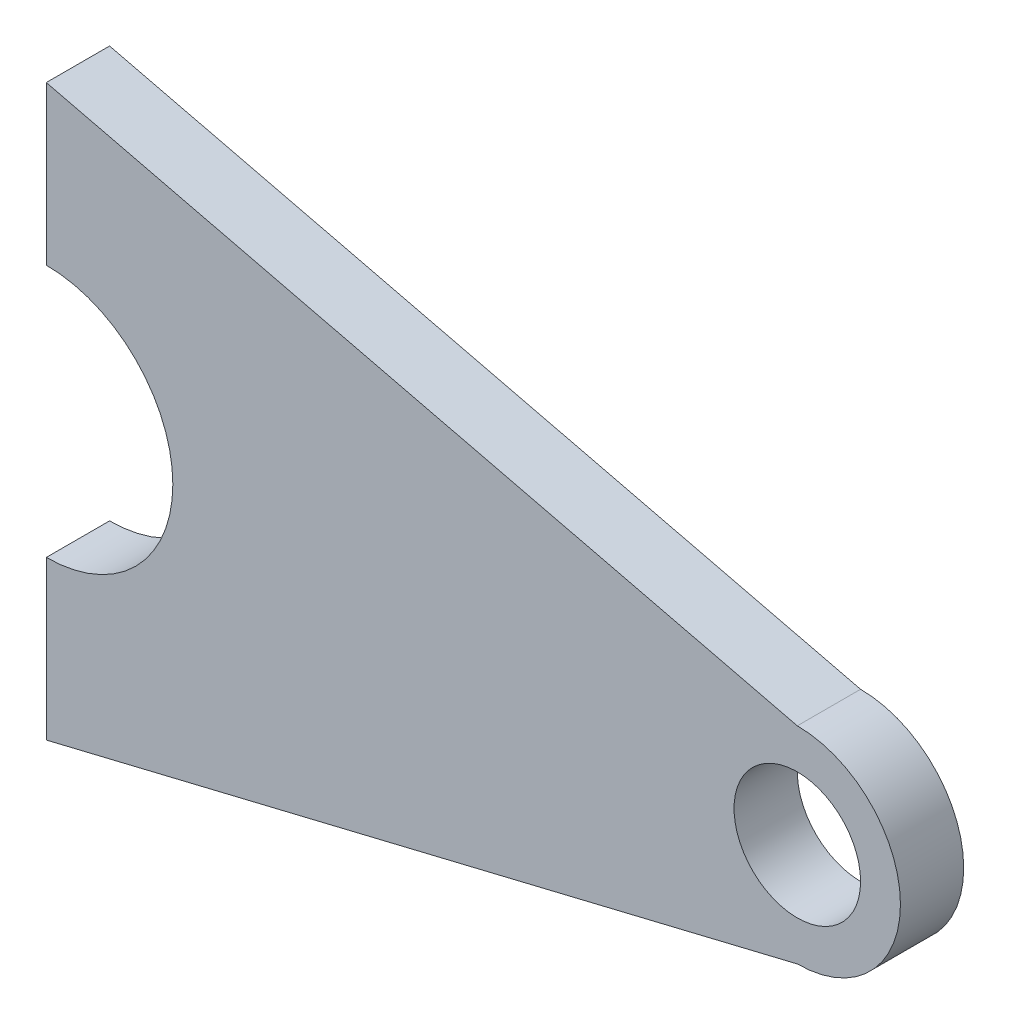
ISO-10303-21;
HEADER;
FILE_DESCRIPTION(('STEP AP214'),'2;1');
FILE_NAME('part.step','',(''),(''),'','','');
FILE_SCHEMA(('AUTOMOTIVE_DESIGN { 1 0 10303 214 1 1 1 1 }'));
ENDSEC;
DATA;
#1=APPLICATION_CONTEXT('core data for automotive mechanical design processes');
#2=APPLICATION_PROTOCOL_DEFINITION('international standard','automotive_design',2000,#1);
#3=PRODUCT_CONTEXT('',#1,'mechanical');
#4=PRODUCT('Part','Part','',(#3));
#5=PRODUCT_RELATED_PRODUCT_CATEGORY('part','',(#4));
#6=PRODUCT_DEFINITION_FORMATION('','',#4);
#7=PRODUCT_DEFINITION_CONTEXT('part definition',#1,'design');
#8=PRODUCT_DEFINITION('design','',#6,#7);
#9=PRODUCT_DEFINITION_SHAPE('','',#8);
#10=(LENGTH_UNIT() NAMED_UNIT(*) SI_UNIT(.MILLI.,.METRE.));
#11=(NAMED_UNIT(*) PLANE_ANGLE_UNIT() SI_UNIT($,.RADIAN.));
#12=(NAMED_UNIT(*) SI_UNIT($,.STERADIAN.) SOLID_ANGLE_UNIT());
#13=UNCERTAINTY_MEASURE_WITH_UNIT(LENGTH_MEASURE(1.E-05),#10,'distance_accuracy_value','');
#14=(GEOMETRIC_REPRESENTATION_CONTEXT(3) GLOBAL_UNCERTAINTY_ASSIGNED_CONTEXT((#13)) GLOBAL_UNIT_ASSIGNED_CONTEXT((#10,
#11,#12)) REPRESENTATION_CONTEXT('',''));
#15=CARTESIAN_POINT('',(0.,0.,0.));
#16=DIRECTION('',(0.,0.,1.));
#17=DIRECTION('',(1.,0.,0.));
#18=AXIS2_PLACEMENT_3D('',#15,#16,#17);
#19=CARTESIAN_POINT('',(-75.375,0.,6.35));
#20=DIRECTION('',(0.,0.,1.));
#21=DIRECTION('',(1.,0.,0.));
#22=AXIS2_PLACEMENT_3D('',#19,#20,#21);
#23=PLANE('',#22);
#24=DIRECTION('',(0.,-1.,0.));
#25=VECTOR('',#24,1.);
#26=CARTESIAN_POINT('',(-75.375,28.575,6.35));
#27=LINE('',#26,#25);
#28=CARTESIAN_POINT('',(-75.375,28.575,6.35));
#29=VERTEX_POINT('',#28);
#30=CARTESIAN_POINT('',(-75.375,12.7,6.35));
#31=VERTEX_POINT('',#30);
#32=EDGE_CURVE('E129',#29,#31,#27,.T.);
#33=ORIENTED_EDGE('',*,*,#32,.T.);
#34=CARTESIAN_POINT('',(-75.375,0.,6.35));
#35=DIRECTION('',(0.,0.,-1.));
#36=DIRECTION('',(1.,0.,0.));
#37=AXIS2_PLACEMENT_3D('',#34,#35,#36);
#38=CIRCLE('',#37,12.7);
#39=CARTESIAN_POINT('',(-75.375,-12.7,6.35));
#40=VERTEX_POINT('',#39);
#41=EDGE_CURVE('E87',#31,#40,#38,.T.);
#42=ORIENTED_EDGE('',*,*,#41,.T.);
#43=DIRECTION('',(0.,-1.,0.));
#44=VECTOR('',#43,1.);
#45=CARTESIAN_POINT('',(-75.375,-12.7,6.35));
#46=LINE('',#45,#44);
#47=CARTESIAN_POINT('',(-75.375,-28.575,6.35));
#48=VERTEX_POINT('',#47);
#49=EDGE_CURVE('E100',#40,#48,#46,.T.);
#50=ORIENTED_EDGE('',*,*,#49,.T.);
#51=DIRECTION('',(0.971990852961697,0.23501868385044,0.));
#52=VECTOR('',#51,1.);
#53=CARTESIAN_POINT('',(0.,-10.35,6.35));
#54=LINE('',#53,#52);
#55=CARTESIAN_POINT('',(0.,-10.35,6.35));
#56=VERTEX_POINT('',#55);
#57=EDGE_CURVE('E94',#48,#56,#54,.T.);
#58=ORIENTED_EDGE('',*,*,#57,.T.);
#59=CARTESIAN_POINT('',(0.,0.,6.35));
#60=DIRECTION('',(0.,0.,1.));
#61=DIRECTION('',(1.,0.,0.));
#62=AXIS2_PLACEMENT_3D('',#59,#60,#61);
#63=CIRCLE('',#62,10.35);
#64=CARTESIAN_POINT('',(0.,10.35,6.35));
#65=VERTEX_POINT('',#64);
#66=EDGE_CURVE('E98',#56,#65,#63,.T.);
#67=ORIENTED_EDGE('',*,*,#66,.T.);
#68=DIRECTION('',(-0.971990852961697,0.23501868385044,0.));
#69=VECTOR('',#68,1.);
#70=CARTESIAN_POINT('',(-75.375,28.575,6.35));
#71=LINE('',#70,#69);
#72=EDGE_CURVE('E50',#65,#29,#71,.T.);
#73=ORIENTED_EDGE('',*,*,#72,.T.);
#74=EDGE_LOOP('',(#33,#42,#50,#58,#67,#73));
#75=FACE_BOUND('',#74,.T.);
#76=CARTESIAN_POINT('',(0.,0.,6.35));
#77=DIRECTION('',(0.,0.,1.));
#78=DIRECTION('',(1.,0.,0.));
#79=AXIS2_PLACEMENT_3D('',#76,#77,#78);
#80=CIRCLE('',#79,6.35);
#81=CARTESIAN_POINT('',(6.35,0.,6.35));
#82=VERTEX_POINT('',#81);
#83=EDGE_CURVE('E122',#82,#82,#80,.T.);
#84=ORIENTED_EDGE('',*,*,#83,.F.);
#85=EDGE_LOOP('',(#84));
#86=FACE_BOUND('',#85,.T.);
#87=ADVANCED_FACE('F33',(#75,#86),#23,.T.);
#88=CARTESIAN_POINT('',(-75.375,0.,0.));
#89=DIRECTION('',(0.,0.,1.));
#90=DIRECTION('',(1.,0.,0.));
#91=AXIS2_PLACEMENT_3D('',#88,#89,#90);
#92=PLANE('',#91);
#93=DIRECTION('',(0.,-1.,0.));
#94=VECTOR('',#93,1.);
#95=CARTESIAN_POINT('',(-75.375,28.575,0.));
#96=LINE('',#95,#94);
#97=CARTESIAN_POINT('',(-75.375,28.575,0.));
#98=VERTEX_POINT('',#97);
#99=CARTESIAN_POINT('',(-75.375,12.7,0.));
#100=VERTEX_POINT('',#99);
#101=EDGE_CURVE('E118',#98,#100,#96,.T.);
#102=ORIENTED_EDGE('',*,*,#101,.F.);
#103=DIRECTION('',(-0.971990852961697,0.23501868385044,0.));
#104=VECTOR('',#103,1.);
#105=CARTESIAN_POINT('',(-75.375,28.575,0.));
#106=LINE('',#105,#104);
#107=CARTESIAN_POINT('',(0.,10.35,0.));
#108=VERTEX_POINT('',#107);
#109=EDGE_CURVE('E79',#108,#98,#106,.T.);
#110=ORIENTED_EDGE('',*,*,#109,.F.);
#111=CARTESIAN_POINT('',(0.,0.,0.));
#112=DIRECTION('',(0.,0.,1.));
#113=DIRECTION('',(1.,0.,0.));
#114=AXIS2_PLACEMENT_3D('',#111,#112,#113);
#115=CIRCLE('',#114,10.35);
#116=CARTESIAN_POINT('',(0.,-10.35,0.));
#117=VERTEX_POINT('',#116);
#118=EDGE_CURVE('E73',#117,#108,#115,.T.);
#119=ORIENTED_EDGE('',*,*,#118,.F.);
#120=DIRECTION('',(0.971990852961697,0.23501868385044,0.));
#121=VECTOR('',#120,1.);
#122=CARTESIAN_POINT('',(0.,-10.35,0.));
#123=LINE('',#122,#121);
#124=CARTESIAN_POINT('',(-75.375,-28.575,0.));
#125=VERTEX_POINT('',#124);
#126=EDGE_CURVE('E108',#125,#117,#123,.T.);
#127=ORIENTED_EDGE('',*,*,#126,.F.);
#128=DIRECTION('',(0.,-1.,0.));
#129=VECTOR('',#128,1.);
#130=CARTESIAN_POINT('',(-75.375,-12.7,0.));
#131=LINE('',#130,#129);
#132=CARTESIAN_POINT('',(-75.375,-12.7,0.));
#133=VERTEX_POINT('',#132);
#134=EDGE_CURVE('E124',#133,#125,#131,.T.);
#135=ORIENTED_EDGE('',*,*,#134,.F.);
#136=CARTESIAN_POINT('',(-75.375,0.,0.));
#137=DIRECTION('',(0.,0.,-1.));
#138=DIRECTION('',(1.,0.,0.));
#139=AXIS2_PLACEMENT_3D('',#136,#137,#138);
#140=CIRCLE('',#139,12.7);
#141=EDGE_CURVE('E121',#100,#133,#140,.T.);
#142=ORIENTED_EDGE('',*,*,#141,.F.);
#143=EDGE_LOOP('',(#102,#110,#119,#127,#135,#142));
#144=FACE_BOUND('',#143,.T.);
#145=CARTESIAN_POINT('',(0.,0.,0.));
#146=DIRECTION('',(0.,0.,1.));
#147=DIRECTION('',(1.,0.,0.));
#148=AXIS2_PLACEMENT_3D('',#145,#146,#147);
#149=CIRCLE('',#148,6.35);
#150=CARTESIAN_POINT('',(6.35,0.,0.));
#151=VERTEX_POINT('',#150);
#152=EDGE_CURVE('E222',#151,#151,#149,.T.);
#153=ORIENTED_EDGE('',*,*,#152,.T.);
#154=EDGE_LOOP('',(#153));
#155=FACE_BOUND('',#154,.T.);
#156=ADVANCED_FACE('F138',(#144,#155),#92,.F.);
#157=CARTESIAN_POINT('',(-75.375,28.575,6.35));
#158=DIRECTION('',(1.,0.,0.));
#159=DIRECTION('',(0.,0.,-1.));
#160=AXIS2_PLACEMENT_3D('',#157,#158,#159);
#161=PLANE('',#160);
#162=ORIENTED_EDGE('',*,*,#101,.T.);
#163=DIRECTION('',(0.,0.,-1.));
#164=VECTOR('',#163,1.);
#165=CARTESIAN_POINT('',(-75.375,12.7,6.35));
#166=LINE('',#165,#164);
#167=EDGE_CURVE('E11',#31,#100,#166,.T.);
#168=ORIENTED_EDGE('',*,*,#167,.F.);
#169=ORIENTED_EDGE('',*,*,#32,.F.);
#170=DIRECTION('',(0.,0.,-1.));
#171=VECTOR('',#170,1.);
#172=CARTESIAN_POINT('',(-75.375,28.575,6.35));
#173=LINE('',#172,#171);
#174=EDGE_CURVE('E114',#29,#98,#173,.T.);
#175=ORIENTED_EDGE('',*,*,#174,.T.);
#176=EDGE_LOOP('',(#162,#168,#169,#175));
#177=FACE_BOUND('',#176,.T.);
#178=ADVANCED_FACE('F35',(#177),#161,.F.);
#179=CARTESIAN_POINT('',(-75.375,0.,6.35));
#180=DIRECTION('',(0.,0.,-1.));
#181=DIRECTION('',(-1.,0.,0.));
#182=AXIS2_PLACEMENT_3D('',#179,#180,#181);
#183=CYLINDRICAL_SURFACE('',#182,12.7);
#184=ORIENTED_EDGE('',*,*,#141,.T.);
#185=DIRECTION('',(0.,0.,-1.));
#186=VECTOR('',#185,1.);
#187=CARTESIAN_POINT('',(-75.375,-12.7,6.35));
#188=LINE('',#187,#186);
#189=EDGE_CURVE('E42',#40,#133,#188,.T.);
#190=ORIENTED_EDGE('',*,*,#189,.F.);
#191=ORIENTED_EDGE('',*,*,#41,.F.);
#192=ORIENTED_EDGE('',*,*,#167,.T.);
#193=EDGE_LOOP('',(#184,#190,#191,#192));
#194=FACE_BOUND('',#193,.T.);
#195=ADVANCED_FACE('F163',(#194),#183,.F.);
#196=CARTESIAN_POINT('',(-75.375,-12.7,6.35));
#197=DIRECTION('',(1.,0.,0.));
#198=DIRECTION('',(0.,0.,-1.));
#199=AXIS2_PLACEMENT_3D('',#196,#197,#198);
#200=PLANE('',#199);
#201=ORIENTED_EDGE('',*,*,#134,.T.);
#202=DIRECTION('',(0.,0.,-1.));
#203=VECTOR('',#202,1.);
#204=CARTESIAN_POINT('',(-75.375,-28.575,6.35));
#205=LINE('',#204,#203);
#206=EDGE_CURVE('E109',#48,#125,#205,.T.);
#207=ORIENTED_EDGE('',*,*,#206,.F.);
#208=ORIENTED_EDGE('',*,*,#49,.F.);
#209=ORIENTED_EDGE('',*,*,#189,.T.);
#210=EDGE_LOOP('',(#201,#207,#208,#209));
#211=FACE_BOUND('',#210,.T.);
#212=ADVANCED_FACE('F135',(#211),#200,.F.);
#213=CARTESIAN_POINT('',(0.,-10.35,6.35));
#214=DIRECTION('',(-0.23501868385044,0.971990852961697,0.));
#215=DIRECTION('',(-0.971990852961697,-0.23501868385044,0.));
#216=AXIS2_PLACEMENT_3D('',#213,#214,#215);
#217=PLANE('',#216);
#218=ORIENTED_EDGE('',*,*,#126,.T.);
#219=DIRECTION('',(0.,0.,-1.));
#220=VECTOR('',#219,1.);
#221=CARTESIAN_POINT('',(0.,-10.35,6.35));
#222=LINE('',#221,#220);
#223=EDGE_CURVE('E105',#56,#117,#222,.T.);
#224=ORIENTED_EDGE('',*,*,#223,.F.);
#225=ORIENTED_EDGE('',*,*,#57,.F.);
#226=ORIENTED_EDGE('',*,*,#206,.T.);
#227=EDGE_LOOP('',(#218,#224,#225,#226));
#228=FACE_BOUND('',#227,.T.);
#229=ADVANCED_FACE('F106',(#228),#217,.F.);
#230=CARTESIAN_POINT('',(0.,0.,6.35));
#231=DIRECTION('',(0.,0.,-1.));
#232=DIRECTION('',(-1.,0.,0.));
#233=AXIS2_PLACEMENT_3D('',#230,#231,#232);
#234=CYLINDRICAL_SURFACE('',#233,10.35);
#235=ORIENTED_EDGE('',*,*,#118,.T.);
#236=DIRECTION('',(0.,0.,-1.));
#237=VECTOR('',#236,1.);
#238=CARTESIAN_POINT('',(0.,10.35,6.35));
#239=LINE('',#238,#237);
#240=EDGE_CURVE('E110',#65,#108,#239,.T.);
#241=ORIENTED_EDGE('',*,*,#240,.F.);
#242=ORIENTED_EDGE('',*,*,#66,.F.);
#243=ORIENTED_EDGE('',*,*,#223,.T.);
#244=EDGE_LOOP('',(#235,#241,#242,#243));
#245=FACE_BOUND('',#244,.T.);
#246=ADVANCED_FACE('F112',(#245),#234,.T.);
#247=CARTESIAN_POINT('',(-75.375,28.575,6.35));
#248=DIRECTION('',(-0.23501868385044,-0.971990852961697,0.));
#249=DIRECTION('',(0.971990852961697,-0.23501868385044,0.));
#250=AXIS2_PLACEMENT_3D('',#247,#248,#249);
#251=PLANE('',#250);
#252=ORIENTED_EDGE('',*,*,#109,.T.);
#253=ORIENTED_EDGE('',*,*,#174,.F.);
#254=ORIENTED_EDGE('',*,*,#72,.F.);
#255=ORIENTED_EDGE('',*,*,#240,.T.);
#256=EDGE_LOOP('',(#252,#253,#254,#255));
#257=FACE_BOUND('',#256,.T.);
#258=ADVANCED_FACE('F143',(#257),#251,.F.);
#259=CARTESIAN_POINT('',(0.,0.,6.35));
#260=DIRECTION('',(0.,0.,-1.));
#261=DIRECTION('',(-1.,0.,0.));
#262=AXIS2_PLACEMENT_3D('',#259,#260,#261);
#263=CYLINDRICAL_SURFACE('',#262,6.35);
#264=ORIENTED_EDGE('',*,*,#83,.T.);
#265=EDGE_LOOP('',(#264));
#266=FACE_BOUND('',#265,.T.);
#267=ORIENTED_EDGE('',*,*,#152,.F.);
#268=EDGE_LOOP('',(#267));
#269=FACE_BOUND('',#268,.T.);
#270=ADVANCED_FACE('F145',(#266,#269),#263,.F.);
#271=CLOSED_SHELL('',(#87,#156,#178,#195,#212,#229,#246,#258,#270));
#272=MANIFOLD_SOLID_BREP('B2',#271);
#273=ADVANCED_BREP_SHAPE_REPRESENTATION('',(#18,#272),#14);
#274=SHAPE_DEFINITION_REPRESENTATION(#9,#273);
ENDSEC;
END-ISO-10303-21;
